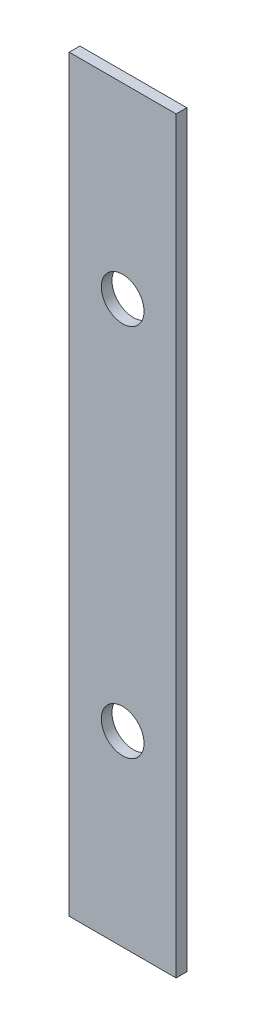
ISO-10303-21;
HEADER;
FILE_DESCRIPTION(('STEP AP214'),'2;1');
FILE_NAME('part.step','',(''),(''),'','','');
FILE_SCHEMA(('AUTOMOTIVE_DESIGN { 1 0 10303 214 1 1 1 1 }'));
ENDSEC;
DATA;
#1=APPLICATION_CONTEXT('core data for automotive mechanical design processes');
#2=APPLICATION_PROTOCOL_DEFINITION('international standard','automotive_design',2000,#1);
#3=PRODUCT_CONTEXT('',#1,'mechanical');
#4=PRODUCT('Part','Part','',(#3));
#5=PRODUCT_RELATED_PRODUCT_CATEGORY('part','',(#4));
#6=PRODUCT_DEFINITION_FORMATION('','',#4);
#7=PRODUCT_DEFINITION_CONTEXT('part definition',#1,'design');
#8=PRODUCT_DEFINITION('design','',#6,#7);
#9=PRODUCT_DEFINITION_SHAPE('','',#8);
#10=(LENGTH_UNIT() NAMED_UNIT(*) SI_UNIT(.MILLI.,.METRE.));
#11=(NAMED_UNIT(*) PLANE_ANGLE_UNIT() SI_UNIT($,.RADIAN.));
#12=(NAMED_UNIT(*) SI_UNIT($,.STERADIAN.) SOLID_ANGLE_UNIT());
#13=UNCERTAINTY_MEASURE_WITH_UNIT(LENGTH_MEASURE(1.E-05),#10,'distance_accuracy_value','');
#14=(GEOMETRIC_REPRESENTATION_CONTEXT(3) GLOBAL_UNCERTAINTY_ASSIGNED_CONTEXT((#13)) GLOBAL_UNIT_ASSIGNED_CONTEXT((#10,
#11,#12)) REPRESENTATION_CONTEXT('',''));
#15=CARTESIAN_POINT('',(0.,0.,0.));
#16=DIRECTION('',(0.,0.,1.));
#17=DIRECTION('',(1.,0.,0.));
#18=AXIS2_PLACEMENT_3D('',#15,#16,#17);
#19=CARTESIAN_POINT('',(-20.,140.,4.));
#20=DIRECTION('',(1.,0.,0.));
#21=DIRECTION('',(0.,1.,0.));
#22=AXIS2_PLACEMENT_3D('',#19,#20,#21);
#23=PLANE('',#22);
#24=DIRECTION('',(0.,-1.,0.));
#25=VECTOR('',#24,1.);
#26=CARTESIAN_POINT('',(-20.,140.,0.));
#27=LINE('',#26,#25);
#28=CARTESIAN_POINT('',(-20.,140.,0.));
#29=VERTEX_POINT('',#28);
#30=CARTESIAN_POINT('',(-20.,-140.,0.));
#31=VERTEX_POINT('',#30);
#32=EDGE_CURVE('E107',#29,#31,#27,.T.);
#33=ORIENTED_EDGE('',*,*,#32,.T.);
#34=DIRECTION('',(0.,0.,-1.));
#35=VECTOR('',#34,1.);
#36=CARTESIAN_POINT('',(-20.,-140.,4.));
#37=LINE('',#36,#35);
#38=CARTESIAN_POINT('',(-20.,-140.,4.));
#39=VERTEX_POINT('',#38);
#40=EDGE_CURVE('E11',#39,#31,#37,.T.);
#41=ORIENTED_EDGE('',*,*,#40,.F.);
#42=DIRECTION('',(0.,-1.,0.));
#43=VECTOR('',#42,1.);
#44=CARTESIAN_POINT('',(-20.,140.,4.));
#45=LINE('',#44,#43);
#46=CARTESIAN_POINT('',(-20.,140.,4.));
#47=VERTEX_POINT('',#46);
#48=EDGE_CURVE('E89',#47,#39,#45,.T.);
#49=ORIENTED_EDGE('',*,*,#48,.F.);
#50=DIRECTION('',(0.,0.,-1.));
#51=VECTOR('',#50,1.);
#52=CARTESIAN_POINT('',(-20.,140.,4.));
#53=LINE('',#52,#51);
#54=EDGE_CURVE('E56',#47,#29,#53,.T.);
#55=ORIENTED_EDGE('',*,*,#54,.T.);
#56=EDGE_LOOP('',(#33,#41,#49,#55));
#57=FACE_BOUND('',#56,.T.);
#58=ADVANCED_FACE('F39',(#57),#23,.F.);
#59=CARTESIAN_POINT('',(-20.,-140.,4.));
#60=DIRECTION('',(0.,1.,0.));
#61=DIRECTION('',(0.,0.,1.));
#62=AXIS2_PLACEMENT_3D('',#59,#60,#61);
#63=PLANE('',#62);
#64=DIRECTION('',(1.,0.,0.));
#65=VECTOR('',#64,1.);
#66=CARTESIAN_POINT('',(-20.,-140.,0.));
#67=LINE('',#66,#65);
#68=CARTESIAN_POINT('',(20.,-140.,0.));
#69=VERTEX_POINT('',#68);
#70=EDGE_CURVE('E95',#31,#69,#67,.T.);
#71=ORIENTED_EDGE('',*,*,#70,.T.);
#72=DIRECTION('',(0.,0.,-1.));
#73=VECTOR('',#72,1.);
#74=CARTESIAN_POINT('',(20.,-140.,4.));
#75=LINE('',#74,#73);
#76=CARTESIAN_POINT('',(20.,-140.,4.));
#77=VERTEX_POINT('',#76);
#78=EDGE_CURVE('E48',#77,#69,#75,.T.);
#79=ORIENTED_EDGE('',*,*,#78,.F.);
#80=DIRECTION('',(1.,0.,0.));
#81=VECTOR('',#80,1.);
#82=CARTESIAN_POINT('',(-20.,-140.,4.));
#83=LINE('',#82,#81);
#84=EDGE_CURVE('E81',#39,#77,#83,.T.);
#85=ORIENTED_EDGE('',*,*,#84,.F.);
#86=ORIENTED_EDGE('',*,*,#40,.T.);
#87=EDGE_LOOP('',(#71,#79,#85,#86));
#88=FACE_BOUND('',#87,.T.);
#89=ADVANCED_FACE('F94',(#88),#63,.F.);
#90=CARTESIAN_POINT('',(20.,140.,4.));
#91=DIRECTION('',(1.,0.,0.));
#92=DIRECTION('',(0.,1.,0.));
#93=AXIS2_PLACEMENT_3D('',#90,#91,#92);
#94=PLANE('',#93);
#95=DIRECTION('',(0.,-1.,0.));
#96=VECTOR('',#95,1.);
#97=CARTESIAN_POINT('',(20.,140.,0.));
#98=LINE('',#97,#96);
#99=CARTESIAN_POINT('',(20.,140.,0.));
#100=VERTEX_POINT('',#99);
#101=EDGE_CURVE('E113',#100,#69,#98,.T.);
#102=ORIENTED_EDGE('',*,*,#101,.F.);
#103=DIRECTION('',(0.,0.,-1.));
#104=VECTOR('',#103,1.);
#105=CARTESIAN_POINT('',(20.,140.,4.));
#106=LINE('',#105,#104);
#107=CARTESIAN_POINT('',(20.,140.,4.));
#108=VERTEX_POINT('',#107);
#109=EDGE_CURVE('E70',#108,#100,#106,.T.);
#110=ORIENTED_EDGE('',*,*,#109,.F.);
#111=DIRECTION('',(0.,-1.,0.));
#112=VECTOR('',#111,1.);
#113=CARTESIAN_POINT('',(20.,140.,4.));
#114=LINE('',#113,#112);
#115=EDGE_CURVE('E88',#108,#77,#114,.T.);
#116=ORIENTED_EDGE('',*,*,#115,.T.);
#117=ORIENTED_EDGE('',*,*,#78,.T.);
#118=EDGE_LOOP('',(#102,#110,#116,#117));
#119=FACE_BOUND('',#118,.T.);
#120=ADVANCED_FACE('F99',(#119),#94,.T.);
#121=CARTESIAN_POINT('',(-20.,140.,4.));
#122=DIRECTION('',(0.,1.,0.));
#123=DIRECTION('',(0.,0.,1.));
#124=AXIS2_PLACEMENT_3D('',#121,#122,#123);
#125=PLANE('',#124);
#126=DIRECTION('',(1.,0.,0.));
#127=VECTOR('',#126,1.);
#128=CARTESIAN_POINT('',(-20.,140.,0.));
#129=LINE('',#128,#127);
#130=EDGE_CURVE('E116',#29,#100,#129,.T.);
#131=ORIENTED_EDGE('',*,*,#130,.F.);
#132=ORIENTED_EDGE('',*,*,#54,.F.);
#133=DIRECTION('',(1.,0.,0.));
#134=VECTOR('',#133,1.);
#135=CARTESIAN_POINT('',(-20.,140.,4.));
#136=LINE('',#135,#134);
#137=EDGE_CURVE('E101',#47,#108,#136,.T.);
#138=ORIENTED_EDGE('',*,*,#137,.T.);
#139=ORIENTED_EDGE('',*,*,#109,.T.);
#140=EDGE_LOOP('',(#131,#132,#138,#139));
#141=FACE_BOUND('',#140,.T.);
#142=ADVANCED_FACE('F156',(#141),#125,.T.);
#143=CARTESIAN_POINT('',(0.,0.,4.));
#144=DIRECTION('',(0.,0.,1.));
#145=DIRECTION('',(1.,0.,0.));
#146=AXIS2_PLACEMENT_3D('',#143,#144,#145);
#147=PLANE('',#146);
#148=CARTESIAN_POINT('',(0.,70.0000000000001,4.));
#149=DIRECTION('',(0.,0.,-1.));
#150=DIRECTION('',(-1.,0.,0.));
#151=AXIS2_PLACEMENT_3D('',#148,#149,#150);
#152=CIRCLE('',#151,8.);
#153=CARTESIAN_POINT('',(-8.00000000000004,70.0000000000001,4.));
#154=VERTEX_POINT('',#153);
#155=EDGE_CURVE('E110',#154,#154,#152,.T.);
#156=ORIENTED_EDGE('',*,*,#155,.T.);
#157=EDGE_LOOP('',(#156));
#158=FACE_BOUND('',#157,.T.);
#159=CARTESIAN_POINT('',(0.,-69.9999999999999,4.));
#160=DIRECTION('',(0.,0.,-1.));
#161=DIRECTION('',(-1.,0.,0.));
#162=AXIS2_PLACEMENT_3D('',#159,#160,#161);
#163=CIRCLE('',#162,8.);
#164=CARTESIAN_POINT('',(-8.00000000000002,-69.9999999999999,4.));
#165=VERTEX_POINT('',#164);
#166=EDGE_CURVE('E130',#165,#165,#163,.T.);
#167=ORIENTED_EDGE('',*,*,#166,.T.);
#168=EDGE_LOOP('',(#167));
#169=FACE_BOUND('',#168,.T.);
#170=ORIENTED_EDGE('',*,*,#48,.T.);
#171=ORIENTED_EDGE('',*,*,#84,.T.);
#172=ORIENTED_EDGE('',*,*,#115,.F.);
#173=ORIENTED_EDGE('',*,*,#137,.F.);
#174=EDGE_LOOP('',(#170,#171,#172,#173));
#175=FACE_BOUND('',#174,.T.);
#176=ADVANCED_FACE('F85',(#158,#169,#175),#147,.T.);
#177=CARTESIAN_POINT('',(0.,0.,0.));
#178=DIRECTION('',(0.,0.,1.));
#179=DIRECTION('',(1.,0.,0.));
#180=AXIS2_PLACEMENT_3D('',#177,#178,#179);
#181=PLANE('',#180);
#182=CARTESIAN_POINT('',(0.,70.0000000000001,0.));
#183=DIRECTION('',(0.,0.,-1.));
#184=DIRECTION('',(-1.,0.,0.));
#185=AXIS2_PLACEMENT_3D('',#182,#183,#184);
#186=CIRCLE('',#185,8.);
#187=CARTESIAN_POINT('',(-8.00000000000004,70.0000000000001,0.));
#188=VERTEX_POINT('',#187);
#189=EDGE_CURVE('E134',#188,#188,#186,.T.);
#190=ORIENTED_EDGE('',*,*,#189,.F.);
#191=EDGE_LOOP('',(#190));
#192=FACE_BOUND('',#191,.T.);
#193=CARTESIAN_POINT('',(0.,-69.9999999999999,0.));
#194=DIRECTION('',(0.,0.,-1.));
#195=DIRECTION('',(-1.,0.,0.));
#196=AXIS2_PLACEMENT_3D('',#193,#194,#195);
#197=CIRCLE('',#196,8.);
#198=CARTESIAN_POINT('',(-8.00000000000002,-69.9999999999999,0.));
#199=VERTEX_POINT('',#198);
#200=EDGE_CURVE('E126',#199,#199,#197,.T.);
#201=ORIENTED_EDGE('',*,*,#200,.F.);
#202=EDGE_LOOP('',(#201));
#203=FACE_BOUND('',#202,.T.);
#204=ORIENTED_EDGE('',*,*,#32,.F.);
#205=ORIENTED_EDGE('',*,*,#130,.T.);
#206=ORIENTED_EDGE('',*,*,#101,.T.);
#207=ORIENTED_EDGE('',*,*,#70,.F.);
#208=EDGE_LOOP('',(#204,#205,#206,#207));
#209=FACE_BOUND('',#208,.T.);
#210=ADVANCED_FACE('F151',(#192,#203,#209),#181,.F.);
#211=CARTESIAN_POINT('',(0.,-69.9999999999999,4.));
#212=DIRECTION('',(0.,0.,-1.));
#213=DIRECTION('',(-1.,0.,0.));
#214=AXIS2_PLACEMENT_3D('',#211,#212,#213);
#215=CYLINDRICAL_SURFACE('',#214,8.);
#216=ORIENTED_EDGE('',*,*,#166,.F.);
#217=EDGE_LOOP('',(#216));
#218=FACE_BOUND('',#217,.T.);
#219=ORIENTED_EDGE('',*,*,#200,.T.);
#220=EDGE_LOOP('',(#219));
#221=FACE_BOUND('',#220,.T.);
#222=ADVANCED_FACE('F147',(#218,#221),#215,.F.);
#223=CARTESIAN_POINT('',(0.,70.0000000000001,4.));
#224=DIRECTION('',(0.,0.,-1.));
#225=DIRECTION('',(-1.,0.,0.));
#226=AXIS2_PLACEMENT_3D('',#223,#224,#225);
#227=CYLINDRICAL_SURFACE('',#226,8.);
#228=ORIENTED_EDGE('',*,*,#155,.F.);
#229=EDGE_LOOP('',(#228));
#230=FACE_BOUND('',#229,.T.);
#231=ORIENTED_EDGE('',*,*,#189,.T.);
#232=EDGE_LOOP('',(#231));
#233=FACE_BOUND('',#232,.T.);
#234=ADVANCED_FACE('F144',(#230,#233),#227,.F.);
#235=CLOSED_SHELL('',(#58,#89,#120,#142,#176,#210,#222,#234));
#236=MANIFOLD_SOLID_BREP('B2',#235);
#237=ADVANCED_BREP_SHAPE_REPRESENTATION('',(#18,#236),#14);
#238=SHAPE_DEFINITION_REPRESENTATION(#9,#237);
ENDSEC;
END-ISO-10303-21;
